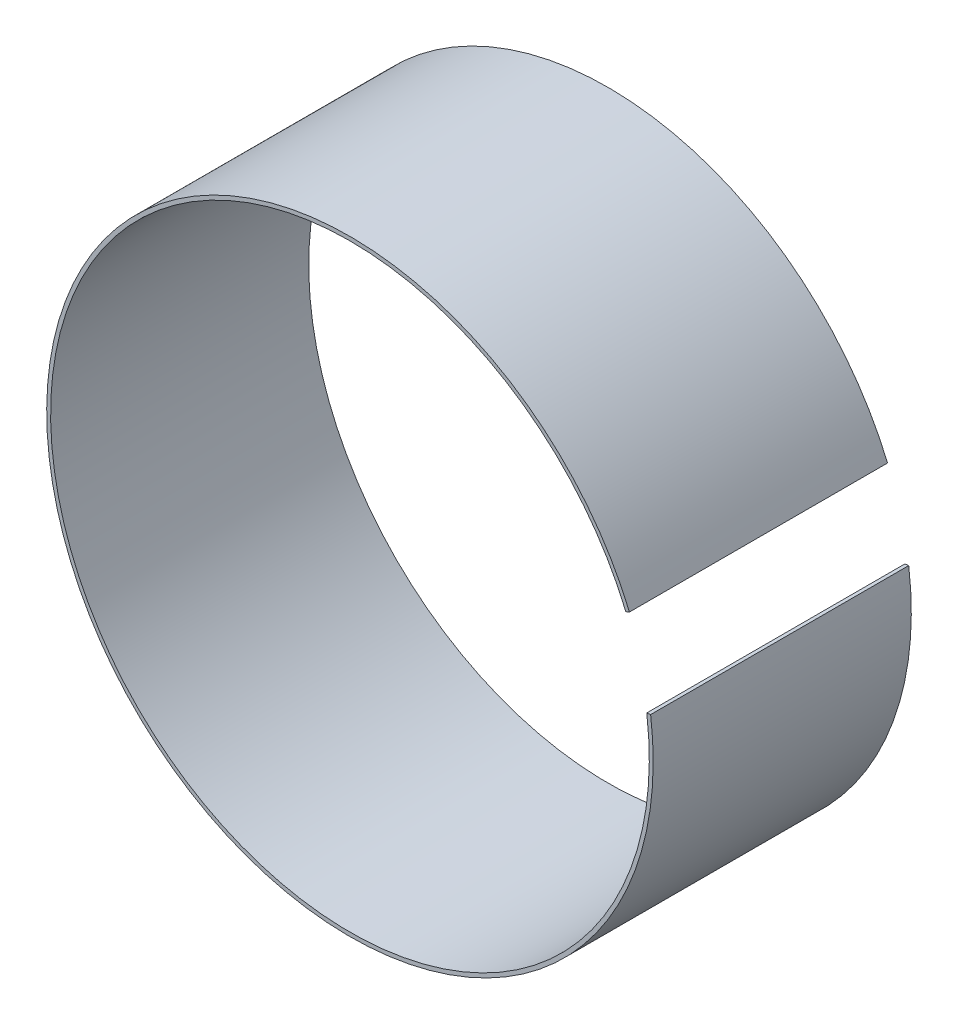
ISO-10303-21;
HEADER;
FILE_DESCRIPTION(('STEP AP214'),'2;1');
FILE_NAME('part.step','',(''),(''),'','','');
FILE_SCHEMA(('AUTOMOTIVE_DESIGN { 1 0 10303 214 1 1 1 1 }'));
ENDSEC;
DATA;
#1=APPLICATION_CONTEXT('core data for automotive mechanical design processes');
#2=APPLICATION_PROTOCOL_DEFINITION('international standard','automotive_design',2000,#1);
#3=PRODUCT_CONTEXT('',#1,'mechanical');
#4=PRODUCT('Part','Part','',(#3));
#5=PRODUCT_RELATED_PRODUCT_CATEGORY('part','',(#4));
#6=PRODUCT_DEFINITION_FORMATION('','',#4);
#7=PRODUCT_DEFINITION_CONTEXT('part definition',#1,'design');
#8=PRODUCT_DEFINITION('design','',#6,#7);
#9=PRODUCT_DEFINITION_SHAPE('','',#8);
#10=(LENGTH_UNIT() NAMED_UNIT(*) SI_UNIT(.MILLI.,.METRE.));
#11=(NAMED_UNIT(*) PLANE_ANGLE_UNIT() SI_UNIT($,.RADIAN.));
#12=(NAMED_UNIT(*) SI_UNIT($,.STERADIAN.) SOLID_ANGLE_UNIT());
#13=UNCERTAINTY_MEASURE_WITH_UNIT(LENGTH_MEASURE(1.E-05),#10,'distance_accuracy_value','');
#14=(GEOMETRIC_REPRESENTATION_CONTEXT(3) GLOBAL_UNCERTAINTY_ASSIGNED_CONTEXT((#13)) GLOBAL_UNIT_ASSIGNED_CONTEXT((#10,
#11,#12)) REPRESENTATION_CONTEXT('',''));
#15=CARTESIAN_POINT('',(0.,0.,0.));
#16=DIRECTION('',(0.,0.,1.));
#17=DIRECTION('',(1.,0.,0.));
#18=AXIS2_PLACEMENT_3D('',#15,#16,#17);
#19=CARTESIAN_POINT('',(0.,0.0030758592513476,33.));
#20=DIRECTION('',(0.,0.,-1.));
#21=DIRECTION('',(-1.,0.,0.));
#22=AXIS2_PLACEMENT_3D('',#19,#20,#21);
#23=CYLINDRICAL_SURFACE('',#22,38.2732058396028);
#24=CARTESIAN_POINT('',(0.,0.0030758592513476,0.));
#25=DIRECTION('',(0.,0.,1.));
#26=DIRECTION('',(1.,0.,0.));
#27=AXIS2_PLACEMENT_3D('',#24,#25,#26);
#28=CIRCLE('',#27,38.2732058396028);
#29=CARTESIAN_POINT('',(37.9482216830812,4.98009869748839,0.));
#30=VERTEX_POINT('',#29);
#31=CARTESIAN_POINT('',(35.275673879632,14.851143665483,0.));
#32=VERTEX_POINT('',#31);
#33=EDGE_CURVE('E111',#30,#32,#28,.F.);
#34=ORIENTED_EDGE('',*,*,#33,.T.);
#35=DIRECTION('',(0.,0.,-1.));
#36=VECTOR('',#35,1.);
#37=CARTESIAN_POINT('',(35.275673879632,14.851143665483,33.));
#38=LINE('',#37,#36);
#39=CARTESIAN_POINT('',(35.275673879632,14.851143665483,33.));
#40=VERTEX_POINT('',#39);
#41=EDGE_CURVE('E11',#40,#32,#38,.T.);
#42=ORIENTED_EDGE('',*,*,#41,.F.);
#43=CARTESIAN_POINT('',(0.,0.0030758592513476,33.));
#44=DIRECTION('',(0.,0.,1.));
#45=DIRECTION('',(1.,0.,0.));
#46=AXIS2_PLACEMENT_3D('',#43,#44,#45);
#47=CIRCLE('',#46,38.2732058396028);
#48=CARTESIAN_POINT('',(37.9482216830812,4.98009869748839,33.));
#49=VERTEX_POINT('',#48);
#50=EDGE_CURVE('E84',#49,#40,#47,.F.);
#51=ORIENTED_EDGE('',*,*,#50,.F.);
#52=DIRECTION('',(0.,0.,-1.));
#53=VECTOR('',#52,1.);
#54=CARTESIAN_POINT('',(37.9482216830812,4.98009869748839,33.));
#55=LINE('',#54,#53);
#56=EDGE_CURVE('E60',#49,#30,#55,.T.);
#57=ORIENTED_EDGE('',*,*,#56,.T.);
#58=EDGE_LOOP('',(#34,#42,#51,#57));
#59=FACE_BOUND('',#58,.T.);
#60=ADVANCED_FACE('F43',(#59),#23,.F.);
#61=CARTESIAN_POINT('',(35.7365142130427,15.0451183728599,33.));
#62=DIRECTION('',(0.387949414753952,-0.921680666821251,0.));
#63=DIRECTION('',(0.921680666821251,0.387949414753952,0.));
#64=AXIS2_PLACEMENT_3D('',#61,#62,#63);
#65=PLANE('',#64);
#66=DIRECTION('',(-0.921680666821251,-0.387949414753952,0.));
#67=VECTOR('',#66,1.);
#68=CARTESIAN_POINT('',(35.7365142130427,15.0451183728599,0.));
#69=LINE('',#68,#67);
#70=CARTESIAN_POINT('',(35.7365142130427,15.0451183728599,0.));
#71=VERTEX_POINT('',#70);
#72=EDGE_CURVE('E93',#71,#32,#69,.T.);
#73=ORIENTED_EDGE('',*,*,#72,.F.);
#74=DIRECTION('',(0.,0.,-1.));
#75=VECTOR('',#74,1.);
#76=CARTESIAN_POINT('',(35.7365142130427,15.0451183728599,33.));
#77=LINE('',#76,#75);
#78=CARTESIAN_POINT('',(35.7365142130427,15.0451183728599,33.));
#79=VERTEX_POINT('',#78);
#80=EDGE_CURVE('E52',#79,#71,#77,.T.);
#81=ORIENTED_EDGE('',*,*,#80,.F.);
#82=DIRECTION('',(-0.921680666821251,-0.387949414753952,0.));
#83=VECTOR('',#82,1.);
#84=CARTESIAN_POINT('',(35.7365142130427,15.0451183728599,33.));
#85=LINE('',#84,#83);
#86=EDGE_CURVE('E91',#79,#40,#85,.T.);
#87=ORIENTED_EDGE('',*,*,#86,.T.);
#88=ORIENTED_EDGE('',*,*,#41,.T.);
#89=EDGE_LOOP('',(#73,#81,#87,#88));
#90=FACE_BOUND('',#89,.T.);
#91=ADVANCED_FACE('F90',(#90),#65,.T.);
#92=CARTESIAN_POINT('',(0.,0.0030758592513476,33.));
#93=DIRECTION('',(0.,0.,-1.));
#94=DIRECTION('',(-1.,0.,0.));
#95=AXIS2_PLACEMENT_3D('',#92,#93,#94);
#96=CYLINDRICAL_SURFACE('',#95,38.7732058396028);
#97=CARTESIAN_POINT('',(0.,0.0030758592513476,0.));
#98=DIRECTION('',(0.,0.,-1.));
#99=DIRECTION('',(-1.,0.,0.));
#100=AXIS2_PLACEMENT_3D('',#97,#98,#99);
#101=CIRCLE('',#100,38.7732058396028);
#102=CARTESIAN_POINT('',(38.4439760999194,5.04511837285991,0.));
#103=VERTEX_POINT('',#102);
#104=EDGE_CURVE('E116',#103,#71,#101,.T.);
#105=ORIENTED_EDGE('',*,*,#104,.F.);
#106=DIRECTION('',(0.,0.,-1.));
#107=VECTOR('',#106,1.);
#108=CARTESIAN_POINT('',(38.4439760999194,5.04511837285991,33.));
#109=LINE('',#108,#107);
#110=CARTESIAN_POINT('',(38.4439760999194,5.04511837285991,33.));
#111=VERTEX_POINT('',#110);
#112=EDGE_CURVE('E73',#111,#103,#109,.T.);
#113=ORIENTED_EDGE('',*,*,#112,.F.);
#114=CARTESIAN_POINT('',(0.,0.0030758592513476,33.));
#115=DIRECTION('',(0.,0.,-1.));
#116=DIRECTION('',(-1.,0.,0.));
#117=AXIS2_PLACEMENT_3D('',#114,#115,#116);
#118=CIRCLE('',#117,38.7732058396028);
#119=EDGE_CURVE('E100',#111,#79,#118,.T.);
#120=ORIENTED_EDGE('',*,*,#119,.T.);
#121=ORIENTED_EDGE('',*,*,#80,.T.);
#122=EDGE_LOOP('',(#105,#113,#120,#121));
#123=FACE_BOUND('',#122,.T.);
#124=ADVANCED_FACE('F103',(#123),#96,.T.);
#125=CARTESIAN_POINT('',(37.9482216830812,4.98009869748839,33.));
#126=DIRECTION('',(-0.130039350743051,0.991508833676395,0.));
#127=DIRECTION('',(-0.991508833676395,-0.130039350743051,0.));
#128=AXIS2_PLACEMENT_3D('',#125,#126,#127);
#129=PLANE('',#128);
#130=DIRECTION('',(0.991508833676395,0.130039350743051,0.));
#131=VECTOR('',#130,1.);
#132=CARTESIAN_POINT('',(37.9482216830812,4.98009869748839,0.));
#133=LINE('',#132,#131);
#134=EDGE_CURVE('E119',#30,#103,#133,.T.);
#135=ORIENTED_EDGE('',*,*,#134,.F.);
#136=ORIENTED_EDGE('',*,*,#56,.F.);
#137=DIRECTION('',(0.991508833676395,0.130039350743051,0.));
#138=VECTOR('',#137,1.);
#139=CARTESIAN_POINT('',(37.9482216830812,4.98009869748839,33.));
#140=LINE('',#139,#138);
#141=EDGE_CURVE('E105',#49,#111,#140,.T.);
#142=ORIENTED_EDGE('',*,*,#141,.T.);
#143=ORIENTED_EDGE('',*,*,#112,.T.);
#144=EDGE_LOOP('',(#135,#136,#142,#143));
#145=FACE_BOUND('',#144,.T.);
#146=ADVANCED_FACE('F129',(#145),#129,.T.);
#147=CARTESIAN_POINT('',(0.,0.0030758592513476,33.));
#148=DIRECTION('',(0.,0.,1.));
#149=DIRECTION('',(1.,0.,0.));
#150=AXIS2_PLACEMENT_3D('',#147,#148,#149);
#151=PLANE('',#150);
#152=ORIENTED_EDGE('',*,*,#50,.T.);
#153=ORIENTED_EDGE('',*,*,#86,.F.);
#154=ORIENTED_EDGE('',*,*,#119,.F.);
#155=ORIENTED_EDGE('',*,*,#141,.F.);
#156=EDGE_LOOP('',(#152,#153,#154,#155));
#157=FACE_BOUND('',#156,.T.);
#158=ADVANCED_FACE('F99',(#157),#151,.T.);
#159=CARTESIAN_POINT('',(0.,0.0030758592513476,0.));
#160=DIRECTION('',(0.,0.,1.));
#161=DIRECTION('',(1.,0.,0.));
#162=AXIS2_PLACEMENT_3D('',#159,#160,#161);
#163=PLANE('',#162);
#164=ORIENTED_EDGE('',*,*,#33,.F.);
#165=ORIENTED_EDGE('',*,*,#134,.T.);
#166=ORIENTED_EDGE('',*,*,#104,.T.);
#167=ORIENTED_EDGE('',*,*,#72,.T.);
#168=EDGE_LOOP('',(#164,#165,#166,#167));
#169=FACE_BOUND('',#168,.T.);
#170=ADVANCED_FACE('F128',(#169),#163,.F.);
#171=CLOSED_SHELL('',(#60,#91,#124,#146,#158,#170));
#172=MANIFOLD_SOLID_BREP('B2',#171);
#173=ADVANCED_BREP_SHAPE_REPRESENTATION('',(#18,#172),#14);
#174=SHAPE_DEFINITION_REPRESENTATION(#9,#173);
ENDSEC;
END-ISO-10303-21;
